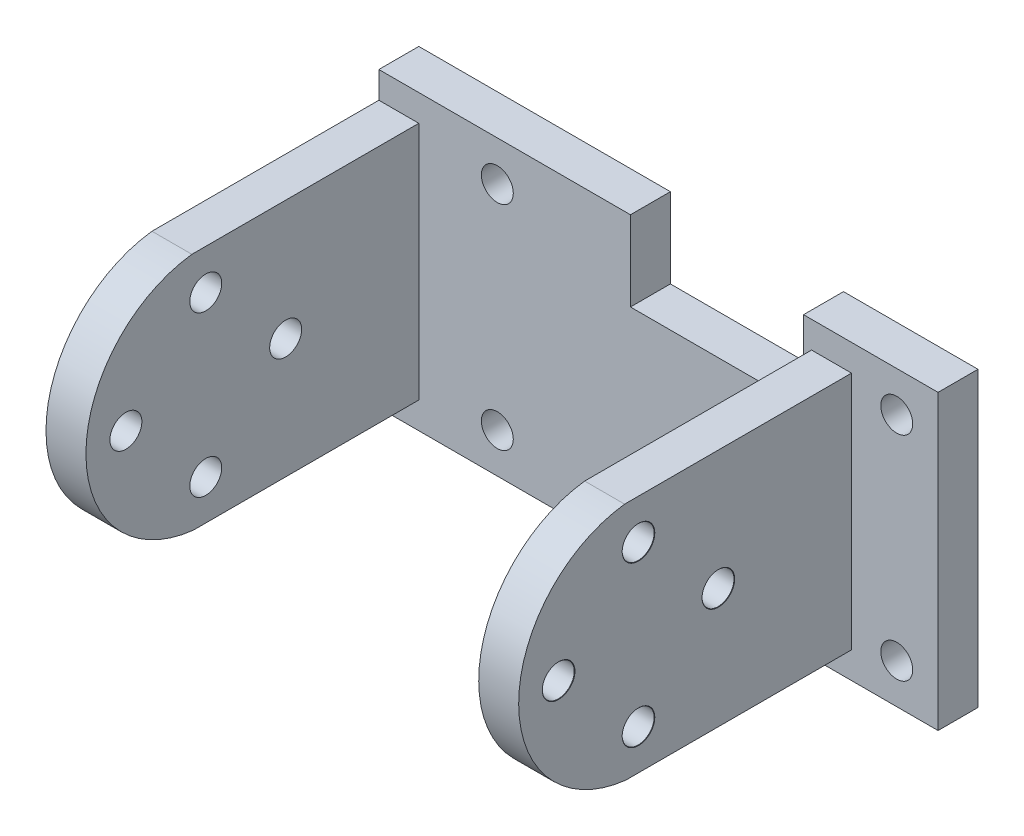
ISO-10303-21;
HEADER;
FILE_DESCRIPTION(('STEP AP214'),'2;1');
FILE_NAME('part.step','',(''),(''),'','','');
FILE_SCHEMA(('AUTOMOTIVE_DESIGN { 1 0 10303 214 1 1 1 1 }'));
ENDSEC;
DATA;
#1=APPLICATION_CONTEXT('core data for automotive mechanical design processes');
#2=APPLICATION_PROTOCOL_DEFINITION('international standard','automotive_design',2000,#1);
#3=PRODUCT_CONTEXT('',#1,'mechanical');
#4=PRODUCT('Part','Part','',(#3));
#5=PRODUCT_RELATED_PRODUCT_CATEGORY('part','',(#4));
#6=PRODUCT_DEFINITION_FORMATION('','',#4);
#7=PRODUCT_DEFINITION_CONTEXT('part definition',#1,'design');
#8=PRODUCT_DEFINITION('design','',#6,#7);
#9=PRODUCT_DEFINITION_SHAPE('','',#8);
#10=(LENGTH_UNIT() NAMED_UNIT(*) SI_UNIT(.MILLI.,.METRE.));
#11=(NAMED_UNIT(*) PLANE_ANGLE_UNIT() SI_UNIT($,.RADIAN.));
#12=(NAMED_UNIT(*) SI_UNIT($,.STERADIAN.) SOLID_ANGLE_UNIT());
#13=UNCERTAINTY_MEASURE_WITH_UNIT(LENGTH_MEASURE(1.E-05),#10,'distance_accuracy_value','');
#14=(GEOMETRIC_REPRESENTATION_CONTEXT(3) GLOBAL_UNCERTAINTY_ASSIGNED_CONTEXT((#13)) GLOBAL_UNIT_ASSIGNED_CONTEXT((#10,
#11,#12)) REPRESENTATION_CONTEXT('',''));
#15=CARTESIAN_POINT('',(0.,0.,0.));
#16=DIRECTION('',(0.,0.,1.));
#17=DIRECTION('',(1.,0.,0.));
#18=AXIS2_PLACEMENT_3D('',#15,#16,#17);
#19=CARTESIAN_POINT('',(0.,0.,163.526991532242));
#20=DIRECTION('',(0.,0.,1.));
#21=DIRECTION('',(1.,0.,0.));
#22=AXIS2_PLACEMENT_3D('',#19,#20,#21);
#23=PLANE('',#22);
#24=CARTESIAN_POINT('',(3.1033233249617,226.326974637373,163.526991532242));
#25=DIRECTION('',(0.,0.,1.));
#26=DIRECTION('',(1.,0.,0.));
#27=AXIS2_PLACEMENT_3D('',#24,#25,#26);
#28=CIRCLE('',#27,1.2);
#29=CARTESIAN_POINT('',(4.3033233249617,226.326974637373,163.526991532242));
#30=VERTEX_POINT('',#29);
#31=EDGE_CURVE('E885',#30,#30,#28,.T.);
#32=ORIENTED_EDGE('',*,*,#31,.F.);
#33=EDGE_LOOP('',(#32));
#34=FACE_BOUND('',#33,.T.);
#35=CARTESIAN_POINT('',(3.10332332496206,210.326974637373,163.526991532242));
#36=DIRECTION('',(0.,0.,1.));
#37=DIRECTION('',(1.,0.,0.));
#38=AXIS2_PLACEMENT_3D('',#35,#36,#37);
#39=CIRCLE('',#38,1.2);
#40=CARTESIAN_POINT('',(4.30332332496206,210.326974637373,163.526991532242));
#41=VERTEX_POINT('',#40);
#42=EDGE_CURVE('E887',#41,#41,#39,.T.);
#43=ORIENTED_EDGE('',*,*,#42,.F.);
#44=EDGE_LOOP('',(#43));
#45=FACE_BOUND('',#44,.T.);
#46=CARTESIAN_POINT('',(33.103323324962,210.326974637373,163.526991532242));
#47=DIRECTION('',(0.,0.,1.));
#48=DIRECTION('',(1.,0.,0.));
#49=AXIS2_PLACEMENT_3D('',#46,#47,#48);
#50=CIRCLE('',#49,1.2);
#51=CARTESIAN_POINT('',(34.303323324962,210.326974637373,163.526991532242));
#52=VERTEX_POINT('',#51);
#53=EDGE_CURVE('E895',#52,#52,#50,.T.);
#54=ORIENTED_EDGE('',*,*,#53,.F.);
#55=EDGE_LOOP('',(#54));
#56=FACE_BOUND('',#55,.T.);
#57=CARTESIAN_POINT('',(33.1033233249617,226.326974637373,163.526991532242));
#58=DIRECTION('',(0.,0.,1.));
#59=DIRECTION('',(1.,0.,0.));
#60=AXIS2_PLACEMENT_3D('',#57,#58,#59);
#61=CIRCLE('',#60,1.2);
#62=CARTESIAN_POINT('',(34.3033233249617,226.326974637373,163.526991532242));
#63=VERTEX_POINT('',#62);
#64=EDGE_CURVE('E901',#63,#63,#61,.T.);
#65=ORIENTED_EDGE('',*,*,#64,.F.);
#66=EDGE_LOOP('',(#65));
#67=FACE_BOUND('',#66,.T.);
#68=DIRECTION('',(-1.,0.,0.));
#69=VECTOR('',#68,1.);
#70=CARTESIAN_POINT('',(-2.79335335007542,227.334615140477,163.526991532241));
#71=LINE('',#70,#69);
#72=CARTESIAN_POINT('',(-2.79335335007542,227.334615140477,163.526991532241));
#73=VERTEX_POINT('',#72);
#74=CARTESIAN_POINT('',(-5.79335335007542,227.334615140477,163.526991532241));
#75=VERTEX_POINT('',#74);
#76=EDGE_CURVE('E245',#73,#75,#71,.T.);
#77=ORIENTED_EDGE('',*,*,#76,.F.);
#78=DIRECTION('',(0.,-1.,0.));
#79=VECTOR('',#78,1.);
#80=CARTESIAN_POINT('',(-2.79335335007542,227.334615140477,163.526991532241));
#81=LINE('',#80,#79);
#82=CARTESIAN_POINT('',(-2.79335335007502,209.334615140477,163.526991532241));
#83=VERTEX_POINT('',#82);
#84=EDGE_CURVE('E225',#73,#83,#81,.T.);
#85=ORIENTED_EDGE('',*,*,#84,.T.);
#86=DIRECTION('',(-1.,0.,0.));
#87=VECTOR('',#86,1.);
#88=CARTESIAN_POINT('',(-2.79335335007502,209.334615140477,163.526991532241));
#89=LINE('',#88,#87);
#90=CARTESIAN_POINT('',(-5.79335335007503,209.334615140477,163.526991532242));
#91=VERTEX_POINT('',#90);
#92=EDGE_CURVE('E242',#83,#91,#89,.T.);
#93=ORIENTED_EDGE('',*,*,#92,.T.);
#94=DIRECTION('',(0.,-1.,0.));
#95=VECTOR('',#94,1.);
#96=CARTESIAN_POINT('',(-5.79335335007547,229.334615140477,163.526991532242));
#97=LINE('',#96,#95);
#98=CARTESIAN_POINT('',(-5.79335335007498,207.334615140477,163.526991532242));
#99=VERTEX_POINT('',#98);
#100=EDGE_CURVE('E322',#91,#99,#97,.T.);
#101=ORIENTED_EDGE('',*,*,#100,.T.);
#102=DIRECTION('',(1.,0.,0.));
#103=VECTOR('',#102,1.);
#104=CARTESIAN_POINT('',(-5.79335335007498,207.334615140477,163.526991532242));
#105=LINE('',#104,#103);
#106=CARTESIAN_POINT('',(13.1033233249621,207.334615140477,163.526991532242));
#107=VERTEX_POINT('',#106);
#108=EDGE_CURVE('E304',#99,#107,#105,.T.);
#109=ORIENTED_EDGE('',*,*,#108,.T.);
#110=DIRECTION('',(0.,1.,0.));
#111=VECTOR('',#110,1.);
#112=CARTESIAN_POINT('',(13.1033233249621,207.334615140477,163.526991532242));
#113=LINE('',#112,#111);
#114=CARTESIAN_POINT('',(13.103323324962,213.334615140477,163.526991532242));
#115=VERTEX_POINT('',#114);
#116=EDGE_CURVE('E251',#107,#115,#113,.T.);
#117=ORIENTED_EDGE('',*,*,#116,.T.);
#118=DIRECTION('',(1.,0.,0.));
#119=VECTOR('',#118,1.);
#120=CARTESIAN_POINT('',(13.103323324962,213.334615140477,163.526991532242));
#121=LINE('',#120,#119);
#122=CARTESIAN_POINT('',(26.103323324962,213.334615140477,163.526991532242));
#123=VERTEX_POINT('',#122);
#124=EDGE_CURVE('E255',#115,#123,#121,.T.);
#125=ORIENTED_EDGE('',*,*,#124,.T.);
#126=DIRECTION('',(0.,-1.,0.));
#127=VECTOR('',#126,1.);
#128=CARTESIAN_POINT('',(26.103323324962,213.334615140477,163.526991532242));
#129=LINE('',#128,#127);
#130=CARTESIAN_POINT('',(26.1033233249621,207.334615140477,163.526991532242));
#131=VERTEX_POINT('',#130);
#132=EDGE_CURVE('E248',#123,#131,#129,.T.);
#133=ORIENTED_EDGE('',*,*,#132,.T.);
#134=CARTESIAN_POINT('',(36.206646649925,207.334615140478,163.526991532242));
#135=VERTEX_POINT('',#134);
#136=EDGE_CURVE('E326',#131,#135,#105,.T.);
#137=ORIENTED_EDGE('',*,*,#136,.T.);
#138=DIRECTION('',(0.,1.,0.));
#139=VECTOR('',#138,1.);
#140=CARTESIAN_POINT('',(36.206646649925,207.334615140478,163.526991532242));
#141=LINE('',#140,#139);
#142=CARTESIAN_POINT('',(36.2066466499245,229.334615140478,163.526991532242));
#143=VERTEX_POINT('',#142);
#144=EDGE_CURVE('E293',#135,#143,#141,.T.);
#145=ORIENTED_EDGE('',*,*,#144,.T.);
#146=DIRECTION('',(-1.,0.,0.));
#147=VECTOR('',#146,1.);
#148=CARTESIAN_POINT('',(36.2066466499245,229.334615140478,163.526991532242));
#149=LINE('',#148,#147);
#150=CARTESIAN_POINT('',(26.1033233249616,229.334615140477,163.526991532242));
#151=VERTEX_POINT('',#150);
#152=EDGE_CURVE('E319',#143,#151,#149,.T.);
#153=ORIENTED_EDGE('',*,*,#152,.T.);
#154=DIRECTION('',(0.,-1.,0.));
#155=VECTOR('',#154,1.);
#156=CARTESIAN_POINT('',(26.1033233249616,229.334615140477,163.526991532242));
#157=LINE('',#156,#155);
#158=CARTESIAN_POINT('',(26.1033233249618,223.334615140477,163.526991532242));
#159=VERTEX_POINT('',#158);
#160=EDGE_CURVE('E277',#151,#159,#157,.T.);
#161=ORIENTED_EDGE('',*,*,#160,.T.);
#162=DIRECTION('',(-1.,0.,0.));
#163=VECTOR('',#162,1.);
#164=CARTESIAN_POINT('',(26.1033233249618,223.334615140477,163.526991532242));
#165=LINE('',#164,#163);
#166=CARTESIAN_POINT('',(13.1033233249618,223.334615140477,163.526991532242));
#167=VERTEX_POINT('',#166);
#168=EDGE_CURVE('E281',#159,#167,#165,.T.);
#169=ORIENTED_EDGE('',*,*,#168,.T.);
#170=DIRECTION('',(0.,1.,0.));
#171=VECTOR('',#170,1.);
#172=CARTESIAN_POINT('',(13.1033233249618,223.334615140477,163.526991532242));
#173=LINE('',#172,#171);
#174=CARTESIAN_POINT('',(13.1033233249616,229.334615140477,163.526991532242));
#175=VERTEX_POINT('',#174);
#176=EDGE_CURVE('E274',#167,#175,#173,.T.);
#177=ORIENTED_EDGE('',*,*,#176,.T.);
#178=CARTESIAN_POINT('',(-5.79335335007547,229.334615140477,163.526991532242));
#179=VERTEX_POINT('',#178);
#180=EDGE_CURVE('E318',#175,#179,#149,.T.);
#181=ORIENTED_EDGE('',*,*,#180,.T.);
#182=EDGE_CURVE('E323',#179,#75,#97,.T.);
#183=ORIENTED_EDGE('',*,*,#182,.T.);
#184=EDGE_LOOP('',(#77,#85,#93,#101,#109,#117,#125,#133,#137,#145,#153,#161,#169,#177,#181,#183));
#185=FACE_BOUND('',#184,.T.);
#186=DIRECTION('',(1.,0.,0.));
#187=VECTOR('',#186,1.);
#188=CARTESIAN_POINT('',(26.7066466499292,209.334615140478,163.526991532241));
#189=LINE('',#188,#187);
#190=CARTESIAN_POINT('',(26.7066466499292,209.334615140478,163.526991532242));
#191=VERTEX_POINT('',#190);
#192=CARTESIAN_POINT('',(29.7066466499292,209.334615140478,163.526991532242));
#193=VERTEX_POINT('',#192);
#194=EDGE_CURVE('E61',#191,#193,#189,.T.);
#195=ORIENTED_EDGE('',*,*,#194,.F.);
#196=DIRECTION('',(0.,1.,0.));
#197=VECTOR('',#196,1.);
#198=CARTESIAN_POINT('',(26.7066466499292,209.334615140478,163.526991532241));
#199=LINE('',#198,#197);
#200=CARTESIAN_POINT('',(26.7066466499292,227.334615140478,163.526991532242));
#201=VERTEX_POINT('',#200);
#202=EDGE_CURVE('E56',#191,#201,#199,.T.);
#203=ORIENTED_EDGE('',*,*,#202,.T.);
#204=DIRECTION('',(1.,0.,0.));
#205=VECTOR('',#204,1.);
#206=CARTESIAN_POINT('',(26.7066466499292,227.334615140478,163.526991532241));
#207=LINE('',#206,#205);
#208=CARTESIAN_POINT('',(29.7066466499292,227.334615140478,163.526991532241));
#209=VERTEX_POINT('',#208);
#210=EDGE_CURVE('E215',#201,#209,#207,.T.);
#211=ORIENTED_EDGE('',*,*,#210,.T.);
#212=DIRECTION('',(0.,1.,0.));
#213=VECTOR('',#212,1.);
#214=CARTESIAN_POINT('',(29.7066466499292,209.334615140478,163.526991532241));
#215=LINE('',#214,#213);
#216=EDGE_CURVE('E200',#193,#209,#215,.T.);
#217=ORIENTED_EDGE('',*,*,#216,.F.);
#218=EDGE_LOOP('',(#195,#203,#211,#217));
#219=FACE_BOUND('',#218,.T.);
#220=ADVANCED_FACE('F39',(#34,#45,#56,#67,#185,#219),#23,.T.);
#221=CARTESIAN_POINT('',(-5.79335335007498,207.334615140477,160.526991532242));
#222=DIRECTION('',(0.,-1.,0.));
#223=DIRECTION('',(1.,0.,0.));
#224=AXIS2_PLACEMENT_3D('',#221,#222,#223);
#225=PLANE('',#224);
#226=DIRECTION('',(0.,0.,-1.));
#227=VECTOR('',#226,1.);
#228=CARTESIAN_POINT('',(26.1033233249621,207.334615140477,163.526991532242));
#229=LINE('',#228,#227);
#230=CARTESIAN_POINT('',(26.1033233249621,207.334615140477,160.526991532241));
#231=VERTEX_POINT('',#230);
#232=EDGE_CURVE('E258',#131,#231,#229,.T.);
#233=ORIENTED_EDGE('',*,*,#232,.T.);
#234=DIRECTION('',(1.,0.,0.));
#235=VECTOR('',#234,1.);
#236=CARTESIAN_POINT('',(-5.79335335007498,207.334615140477,160.526991532242));
#237=LINE('',#236,#235);
#238=CARTESIAN_POINT('',(36.206646649925,207.334615140478,160.526991532242));
#239=VERTEX_POINT('',#238);
#240=EDGE_CURVE('E311',#231,#239,#237,.T.);
#241=ORIENTED_EDGE('',*,*,#240,.T.);
#242=DIRECTION('',(0.,0.,1.));
#243=VECTOR('',#242,1.);
#244=CARTESIAN_POINT('',(36.206646649925,207.334615140478,160.526991532242));
#245=LINE('',#244,#243);
#246=EDGE_CURVE('E11',#239,#135,#245,.T.);
#247=ORIENTED_EDGE('',*,*,#246,.T.);
#248=ORIENTED_EDGE('',*,*,#136,.F.);
#249=EDGE_LOOP('',(#233,#241,#247,#248));
#250=FACE_BOUND('',#249,.T.);
#251=ADVANCED_FACE('F428',(#250),#225,.T.);
#252=CARTESIAN_POINT('',(36.2066466499245,229.334615140478,160.526991532242));
#253=DIRECTION('',(0.,1.,0.));
#254=DIRECTION('',(-1.,0.,0.));
#255=AXIS2_PLACEMENT_3D('',#252,#253,#254);
#256=PLANE('',#255);
#257=DIRECTION('',(0.,0.,-1.));
#258=VECTOR('',#257,1.);
#259=CARTESIAN_POINT('',(13.1033233249616,229.334615140477,163.526991532242));
#260=LINE('',#259,#258);
#261=CARTESIAN_POINT('',(13.1033233249616,229.334615140477,160.526991532241));
#262=VERTEX_POINT('',#261);
#263=EDGE_CURVE('E284',#175,#262,#260,.T.);
#264=ORIENTED_EDGE('',*,*,#263,.T.);
#265=DIRECTION('',(-1.,0.,0.));
#266=VECTOR('',#265,1.);
#267=CARTESIAN_POINT('',(36.2066466499245,229.334615140478,160.526991532242));
#268=LINE('',#267,#266);
#269=CARTESIAN_POINT('',(-5.79335335007547,229.334615140477,160.526991532242));
#270=VERTEX_POINT('',#269);
#271=EDGE_CURVE('E303',#262,#270,#268,.T.);
#272=ORIENTED_EDGE('',*,*,#271,.T.);
#273=DIRECTION('',(0.,0.,1.));
#274=VECTOR('',#273,1.);
#275=CARTESIAN_POINT('',(-5.79335335007547,229.334615140477,160.526991532242));
#276=LINE('',#275,#274);
#277=EDGE_CURVE('E331',#270,#179,#276,.T.);
#278=ORIENTED_EDGE('',*,*,#277,.T.);
#279=ORIENTED_EDGE('',*,*,#180,.F.);
#280=EDGE_LOOP('',(#264,#272,#278,#279));
#281=FACE_BOUND('',#280,.T.);
#282=ADVANCED_FACE('F454',(#281),#256,.T.);
#283=CARTESIAN_POINT('',(36.206646649925,207.334615140478,160.526991532242));
#284=DIRECTION('',(1.,0.,0.));
#285=DIRECTION('',(0.,1.,0.));
#286=AXIS2_PLACEMENT_3D('',#283,#284,#285);
#287=PLANE('',#286);
#288=ORIENTED_EDGE('',*,*,#144,.F.);
#289=ORIENTED_EDGE('',*,*,#246,.F.);
#290=DIRECTION('',(0.,1.,0.));
#291=VECTOR('',#290,1.);
#292=CARTESIAN_POINT('',(36.206646649925,207.334615140478,160.526991532242));
#293=LINE('',#292,#291);
#294=CARTESIAN_POINT('',(36.2066466499245,229.334615140478,160.526991532242));
#295=VERTEX_POINT('',#294);
#296=EDGE_CURVE('E300',#239,#295,#293,.T.);
#297=ORIENTED_EDGE('',*,*,#296,.T.);
#298=DIRECTION('',(0.,0.,1.));
#299=VECTOR('',#298,1.);
#300=CARTESIAN_POINT('',(36.2066466499245,229.334615140478,160.526991532242));
#301=LINE('',#300,#299);
#302=EDGE_CURVE('E315',#295,#143,#301,.T.);
#303=ORIENTED_EDGE('',*,*,#302,.T.);
#304=EDGE_LOOP('',(#288,#289,#297,#303));
#305=FACE_BOUND('',#304,.T.);
#306=ADVANCED_FACE('F41',(#305),#287,.T.);
#307=DIRECTION('',(0.,0.,-1.));
#308=VECTOR('',#307,1.);
#309=CARTESIAN_POINT('',(13.1033233249621,207.334615140477,163.526991532242));
#310=LINE('',#309,#308);
#311=CARTESIAN_POINT('',(13.1033233249621,207.334615140477,160.526991532241));
#312=VERTEX_POINT('',#311);
#313=EDGE_CURVE('E270',#107,#312,#310,.T.);
#314=ORIENTED_EDGE('',*,*,#313,.F.);
#315=ORIENTED_EDGE('',*,*,#108,.F.);
#316=DIRECTION('',(0.,0.,1.));
#317=VECTOR('',#316,1.);
#318=CARTESIAN_POINT('',(-5.79335335007498,207.334615140477,160.526991532242));
#319=LINE('',#318,#317);
#320=CARTESIAN_POINT('',(-5.79335335007498,207.334615140477,160.526991532242));
#321=VERTEX_POINT('',#320);
#322=EDGE_CURVE('E48',#321,#99,#319,.T.);
#323=ORIENTED_EDGE('',*,*,#322,.F.);
#324=EDGE_CURVE('E312',#321,#312,#237,.T.);
#325=ORIENTED_EDGE('',*,*,#324,.T.);
#326=EDGE_LOOP('',(#314,#315,#323,#325));
#327=FACE_BOUND('',#326,.T.);
#328=ADVANCED_FACE('F414',(#327),#225,.T.);
#329=CARTESIAN_POINT('',(-5.79335335007547,229.334615140477,160.526991532242));
#330=DIRECTION('',(-1.,0.,0.));
#331=DIRECTION('',(0.,-1.,0.));
#332=AXIS2_PLACEMENT_3D('',#329,#330,#331);
#333=PLANE('',#332);
#334=CARTESIAN_POINT('',(-5.79335335007547,224.334217217214,179.527190493873));
#335=DIRECTION('',(1.,0.,0.));
#336=DIRECTION('',(0.,0.,-1.));
#337=AXIS2_PLACEMENT_3D('',#334,#335,#336);
#338=CIRCLE('',#337,1.20000000000001);
#339=CARTESIAN_POINT('',(-5.79335335007547,224.334217217214,178.327190493873));
#340=VERTEX_POINT('',#339);
#341=EDGE_CURVE('E913',#340,#340,#338,.T.);
#342=ORIENTED_EDGE('',*,*,#341,.T.);
#343=EDGE_LOOP('',(#342));
#344=FACE_BOUND('',#343,.T.);
#345=CARTESIAN_POINT('',(-5.79335335007547,218.334416178846,185.526991532241));
#346=DIRECTION('',(1.,0.,0.));
#347=DIRECTION('',(0.,0.,-1.));
#348=AXIS2_PLACEMENT_3D('',#345,#346,#347);
#349=CIRCLE('',#348,1.20000000000001);
#350=CARTESIAN_POINT('',(-5.79335335007547,218.334416178846,184.326991532241));
#351=VERTEX_POINT('',#350);
#352=EDGE_CURVE('E346',#351,#351,#349,.T.);
#353=ORIENTED_EDGE('',*,*,#352,.T.);
#354=EDGE_LOOP('',(#353));
#355=FACE_BOUND('',#354,.T.);
#356=CARTESIAN_POINT('',(-5.79335335007547,212.334615140478,179.527190493873));
#357=DIRECTION('',(1.,0.,0.));
#358=DIRECTION('',(0.,0.,-1.));
#359=AXIS2_PLACEMENT_3D('',#356,#357,#358);
#360=CIRCLE('',#359,1.20000000000001);
#361=CARTESIAN_POINT('',(-5.79335335007547,212.334615140478,178.327190493873));
#362=VERTEX_POINT('',#361);
#363=EDGE_CURVE('E342',#362,#362,#360,.T.);
#364=ORIENTED_EDGE('',*,*,#363,.T.);
#365=EDGE_LOOP('',(#364));
#366=FACE_BOUND('',#365,.T.);
#367=CARTESIAN_POINT('',(-5.79335335007547,218.334416178846,173.527389455505));
#368=DIRECTION('',(1.,0.,0.));
#369=DIRECTION('',(0.,0.,-1.));
#370=AXIS2_PLACEMENT_3D('',#367,#368,#369);
#371=CIRCLE('',#370,1.20000000000001);
#372=CARTESIAN_POINT('',(-5.79335335007547,218.334416178846,172.327389455505));
#373=VERTEX_POINT('',#372);
#374=EDGE_CURVE('E338',#373,#373,#371,.T.);
#375=ORIENTED_EDGE('',*,*,#374,.T.);
#376=EDGE_LOOP('',(#375));
#377=FACE_BOUND('',#376,.T.);
#378=ORIENTED_EDGE('',*,*,#182,.F.);
#379=ORIENTED_EDGE('',*,*,#277,.F.);
#380=DIRECTION('',(0.,-1.,0.));
#381=VECTOR('',#380,1.);
#382=CARTESIAN_POINT('',(-5.79335335007547,229.334615140477,160.526991532242));
#383=LINE('',#382,#381);
#384=EDGE_CURVE('E308',#270,#321,#383,.T.);
#385=ORIENTED_EDGE('',*,*,#384,.T.);
#386=ORIENTED_EDGE('',*,*,#322,.T.);
#387=ORIENTED_EDGE('',*,*,#100,.F.);
#388=DIRECTION('',(0.,0.,1.));
#389=VECTOR('',#388,1.);
#390=CARTESIAN_POINT('',(-5.79335335007503,209.334615140477,163.526991532241));
#391=LINE('',#390,#389);
#392=CARTESIAN_POINT('',(-5.79335335007503,209.334615140477,180.473917610371));
#393=VERTEX_POINT('',#392);
#394=EDGE_CURVE('E222',#91,#393,#391,.T.);
#395=ORIENTED_EDGE('',*,*,#394,.T.);
#396=CARTESIAN_POINT('',(-5.79335335007522,218.340265597928,179.465004194161));
#397=DIRECTION('',(-1.,0.,0.));
#398=DIRECTION('',(0.,-1.,0.));
#399=AXIS2_PLACEMENT_3D('',#396,#397,#398);
#400=CIRCLE('',#399,9.06198909970576);
#401=CARTESIAN_POINT('',(-5.79335335007542,227.334615140477,180.570138914287));
#402=VERTEX_POINT('',#401);
#403=EDGE_CURVE('E214',#393,#402,#400,.T.);
#404=ORIENTED_EDGE('',*,*,#403,.T.);
#405=DIRECTION('',(0.,0.,-1.));
#406=VECTOR('',#405,1.);
#407=CARTESIAN_POINT('',(-5.79335335007542,227.334615140477,180.570138914287));
#408=LINE('',#407,#406);
#409=EDGE_CURVE('E234',#402,#75,#408,.T.);
#410=ORIENTED_EDGE('',*,*,#409,.T.);
#411=EDGE_LOOP('',(#378,#379,#385,#386,#387,#395,#404,#410));
#412=FACE_BOUND('',#411,.T.);
#413=ADVANCED_FACE('F379',(#344,#355,#366,#377,#412),#333,.T.);
#414=DIRECTION('',(0.,0.,-1.));
#415=VECTOR('',#414,1.);
#416=CARTESIAN_POINT('',(26.1033233249616,229.334615140477,163.526991532242));
#417=LINE('',#416,#415);
#418=CARTESIAN_POINT('',(26.1033233249616,229.334615140477,160.526991532241));
#419=VERTEX_POINT('',#418);
#420=EDGE_CURVE('E296',#151,#419,#417,.T.);
#421=ORIENTED_EDGE('',*,*,#420,.F.);
#422=ORIENTED_EDGE('',*,*,#152,.F.);
#423=ORIENTED_EDGE('',*,*,#302,.F.);
#424=EDGE_CURVE('E305',#295,#419,#268,.T.);
#425=ORIENTED_EDGE('',*,*,#424,.T.);
#426=EDGE_LOOP('',(#421,#422,#423,#425));
#427=FACE_BOUND('',#426,.T.);
#428=ADVANCED_FACE('F437',(#427),#256,.T.);
#429=CARTESIAN_POINT('',(0.,0.,160.526991532242));
#430=DIRECTION('',(0.,0.,1.));
#431=DIRECTION('',(1.,0.,0.));
#432=AXIS2_PLACEMENT_3D('',#429,#430,#431);
#433=PLANE('',#432);
#434=CARTESIAN_POINT('',(3.1033233249617,226.326974637373,160.526991532241));
#435=DIRECTION('',(0.,0.,1.));
#436=DIRECTION('',(1.,0.,0.));
#437=AXIS2_PLACEMENT_3D('',#434,#435,#436);
#438=CIRCLE('',#437,1.2);
#439=CARTESIAN_POINT('',(4.3033233249617,226.326974637373,160.526991532241));
#440=VERTEX_POINT('',#439);
#441=EDGE_CURVE('E883',#440,#440,#438,.T.);
#442=ORIENTED_EDGE('',*,*,#441,.T.);
#443=EDGE_LOOP('',(#442));
#444=FACE_BOUND('',#443,.T.);
#445=CARTESIAN_POINT('',(3.10332332496206,210.326974637373,160.526991532241));
#446=DIRECTION('',(0.,0.,1.));
#447=DIRECTION('',(1.,0.,0.));
#448=AXIS2_PLACEMENT_3D('',#445,#446,#447);
#449=CIRCLE('',#448,1.2);
#450=CARTESIAN_POINT('',(4.30332332496206,210.326974637373,160.526991532241));
#451=VERTEX_POINT('',#450);
#452=EDGE_CURVE('E892',#451,#451,#449,.T.);
#453=ORIENTED_EDGE('',*,*,#452,.T.);
#454=EDGE_LOOP('',(#453));
#455=FACE_BOUND('',#454,.T.);
#456=CARTESIAN_POINT('',(33.103323324962,210.326974637373,160.526991532241));
#457=DIRECTION('',(0.,0.,1.));
#458=DIRECTION('',(1.,0.,0.));
#459=AXIS2_PLACEMENT_3D('',#456,#457,#458);
#460=CIRCLE('',#459,1.2);
#461=CARTESIAN_POINT('',(34.303323324962,210.326974637373,160.526991532241));
#462=VERTEX_POINT('',#461);
#463=EDGE_CURVE('E898',#462,#462,#460,.T.);
#464=ORIENTED_EDGE('',*,*,#463,.T.);
#465=EDGE_LOOP('',(#464));
#466=FACE_BOUND('',#465,.T.);
#467=CARTESIAN_POINT('',(33.1033233249617,226.326974637373,160.526991532241));
#468=DIRECTION('',(0.,0.,1.));
#469=DIRECTION('',(1.,0.,0.));
#470=AXIS2_PLACEMENT_3D('',#467,#468,#469);
#471=CIRCLE('',#470,1.2);
#472=CARTESIAN_POINT('',(34.3033233249617,226.326974637373,160.526991532241));
#473=VERTEX_POINT('',#472);
#474=EDGE_CURVE('E904',#473,#473,#471,.T.);
#475=ORIENTED_EDGE('',*,*,#474,.T.);
#476=EDGE_LOOP('',(#475));
#477=FACE_BOUND('',#476,.T.);
#478=ORIENTED_EDGE('',*,*,#240,.F.);
#479=DIRECTION('',(0.,-1.,0.));
#480=VECTOR('',#479,1.);
#481=CARTESIAN_POINT('',(26.103323324962,213.334615140477,160.526991532241));
#482=LINE('',#481,#480);
#483=CARTESIAN_POINT('',(26.103323324962,213.334615140477,160.526991532241));
#484=VERTEX_POINT('',#483);
#485=EDGE_CURVE('E241',#484,#231,#482,.T.);
#486=ORIENTED_EDGE('',*,*,#485,.F.);
#487=DIRECTION('',(1.,0.,0.));
#488=VECTOR('',#487,1.);
#489=CARTESIAN_POINT('',(13.103323324962,213.334615140477,160.526991532241));
#490=LINE('',#489,#488);
#491=CARTESIAN_POINT('',(13.103323324962,213.334615140477,160.526991532241));
#492=VERTEX_POINT('',#491);
#493=EDGE_CURVE('E252',#492,#484,#490,.T.);
#494=ORIENTED_EDGE('',*,*,#493,.F.);
#495=DIRECTION('',(0.,1.,0.));
#496=VECTOR('',#495,1.);
#497=CARTESIAN_POINT('',(13.1033233249621,207.334615140477,160.526991532241));
#498=LINE('',#497,#496);
#499=EDGE_CURVE('E260',#312,#492,#498,.T.);
#500=ORIENTED_EDGE('',*,*,#499,.F.);
#501=ORIENTED_EDGE('',*,*,#324,.F.);
#502=ORIENTED_EDGE('',*,*,#384,.F.);
#503=ORIENTED_EDGE('',*,*,#271,.F.);
#504=DIRECTION('',(0.,1.,0.));
#505=VECTOR('',#504,1.);
#506=CARTESIAN_POINT('',(13.1033233249618,223.334615140477,160.526991532241));
#507=LINE('',#506,#505);
#508=CARTESIAN_POINT('',(13.1033233249618,223.334615140477,160.526991532241));
#509=VERTEX_POINT('',#508);
#510=EDGE_CURVE('E267',#509,#262,#507,.T.);
#511=ORIENTED_EDGE('',*,*,#510,.F.);
#512=DIRECTION('',(-1.,0.,0.));
#513=VECTOR('',#512,1.);
#514=CARTESIAN_POINT('',(26.1033233249618,223.334615140477,160.526991532241));
#515=LINE('',#514,#513);
#516=CARTESIAN_POINT('',(26.1033233249618,223.334615140477,160.526991532241));
#517=VERTEX_POINT('',#516);
#518=EDGE_CURVE('E278',#517,#509,#515,.T.);
#519=ORIENTED_EDGE('',*,*,#518,.F.);
#520=DIRECTION('',(0.,-1.,0.));
#521=VECTOR('',#520,1.);
#522=CARTESIAN_POINT('',(26.1033233249616,229.334615140477,160.526991532241));
#523=LINE('',#522,#521);
#524=EDGE_CURVE('E286',#419,#517,#523,.T.);
#525=ORIENTED_EDGE('',*,*,#524,.F.);
#526=ORIENTED_EDGE('',*,*,#424,.F.);
#527=ORIENTED_EDGE('',*,*,#296,.F.);
#528=EDGE_LOOP('',(#478,#486,#494,#500,#501,#502,#503,#511,#519,#525,#526,#527));
#529=FACE_BOUND('',#528,.T.);
#530=ADVANCED_FACE('F445',(#444,#455,#466,#477,#529),#433,.F.);
#531=CARTESIAN_POINT('',(13.1033233249618,223.334615140477,163.526991532242));
#532=DIRECTION('',(-1.,0.,0.));
#533=DIRECTION('',(0.,-1.,0.));
#534=AXIS2_PLACEMENT_3D('',#531,#532,#533);
#535=PLANE('',#534);
#536=ORIENTED_EDGE('',*,*,#510,.T.);
#537=ORIENTED_EDGE('',*,*,#263,.F.);
#538=ORIENTED_EDGE('',*,*,#176,.F.);
#539=DIRECTION('',(0.,0.,-1.));
#540=VECTOR('',#539,1.);
#541=CARTESIAN_POINT('',(13.1033233249618,223.334615140477,163.526991532242));
#542=LINE('',#541,#540);
#543=EDGE_CURVE('E291',#167,#509,#542,.T.);
#544=ORIENTED_EDGE('',*,*,#543,.T.);
#545=EDGE_LOOP('',(#536,#537,#538,#544));
#546=FACE_BOUND('',#545,.T.);
#547=ADVANCED_FACE('F487',(#546),#535,.F.);
#548=CARTESIAN_POINT('',(26.1033233249618,223.334615140477,163.526991532242));
#549=DIRECTION('',(0.,-1.,0.));
#550=DIRECTION('',(1.,0.,0.));
#551=AXIS2_PLACEMENT_3D('',#548,#549,#550);
#552=PLANE('',#551);
#553=ORIENTED_EDGE('',*,*,#518,.T.);
#554=ORIENTED_EDGE('',*,*,#543,.F.);
#555=ORIENTED_EDGE('',*,*,#168,.F.);
#556=DIRECTION('',(0.,0.,-1.));
#557=VECTOR('',#556,1.);
#558=CARTESIAN_POINT('',(26.1033233249618,223.334615140477,163.526991532242));
#559=LINE('',#558,#557);
#560=EDGE_CURVE('E294',#159,#517,#559,.T.);
#561=ORIENTED_EDGE('',*,*,#560,.T.);
#562=EDGE_LOOP('',(#553,#554,#555,#561));
#563=FACE_BOUND('',#562,.T.);
#564=ADVANCED_FACE('F449',(#563),#552,.F.);
#565=CARTESIAN_POINT('',(26.1033233249616,229.334615140477,163.526991532242));
#566=DIRECTION('',(1.,0.,0.));
#567=DIRECTION('',(0.,1.,0.));
#568=AXIS2_PLACEMENT_3D('',#565,#566,#567);
#569=PLANE('',#568);
#570=ORIENTED_EDGE('',*,*,#524,.T.);
#571=ORIENTED_EDGE('',*,*,#560,.F.);
#572=ORIENTED_EDGE('',*,*,#160,.F.);
#573=ORIENTED_EDGE('',*,*,#420,.T.);
#574=EDGE_LOOP('',(#570,#571,#572,#573));
#575=FACE_BOUND('',#574,.T.);
#576=ADVANCED_FACE('F441',(#575),#569,.F.);
#577=CARTESIAN_POINT('',(26.103323324962,213.334615140477,163.526991532242));
#578=DIRECTION('',(1.,0.,0.));
#579=DIRECTION('',(0.,1.,0.));
#580=AXIS2_PLACEMENT_3D('',#577,#578,#579);
#581=PLANE('',#580);
#582=ORIENTED_EDGE('',*,*,#485,.T.);
#583=ORIENTED_EDGE('',*,*,#232,.F.);
#584=ORIENTED_EDGE('',*,*,#132,.F.);
#585=DIRECTION('',(0.,0.,-1.));
#586=VECTOR('',#585,1.);
#587=CARTESIAN_POINT('',(26.103323324962,213.334615140477,163.526991532242));
#588=LINE('',#587,#586);
#589=EDGE_CURVE('E265',#123,#484,#588,.T.);
#590=ORIENTED_EDGE('',*,*,#589,.T.);
#591=EDGE_LOOP('',(#582,#583,#584,#590));
#592=FACE_BOUND('',#591,.T.);
#593=ADVANCED_FACE('F425',(#592),#581,.F.);
#594=CARTESIAN_POINT('',(13.103323324962,213.334615140477,163.526991532242));
#595=DIRECTION('',(0.,1.,0.));
#596=DIRECTION('',(-1.,0.,0.));
#597=AXIS2_PLACEMENT_3D('',#594,#595,#596);
#598=PLANE('',#597);
#599=ORIENTED_EDGE('',*,*,#493,.T.);
#600=ORIENTED_EDGE('',*,*,#589,.F.);
#601=ORIENTED_EDGE('',*,*,#124,.F.);
#602=DIRECTION('',(0.,0.,-1.));
#603=VECTOR('',#602,1.);
#604=CARTESIAN_POINT('',(13.103323324962,213.334615140477,163.526991532242));
#605=LINE('',#604,#603);
#606=EDGE_CURVE('E268',#115,#492,#605,.T.);
#607=ORIENTED_EDGE('',*,*,#606,.T.);
#608=EDGE_LOOP('',(#599,#600,#601,#607));
#609=FACE_BOUND('',#608,.T.);
#610=ADVANCED_FACE('F421',(#609),#598,.F.);
#611=CARTESIAN_POINT('',(13.1033233249621,207.334615140477,163.526991532242));
#612=DIRECTION('',(-1.,0.,0.));
#613=DIRECTION('',(0.,-1.,0.));
#614=AXIS2_PLACEMENT_3D('',#611,#612,#613);
#615=PLANE('',#614);
#616=ORIENTED_EDGE('',*,*,#499,.T.);
#617=ORIENTED_EDGE('',*,*,#606,.F.);
#618=ORIENTED_EDGE('',*,*,#116,.F.);
#619=ORIENTED_EDGE('',*,*,#313,.T.);
#620=EDGE_LOOP('',(#616,#617,#618,#619));
#621=FACE_BOUND('',#620,.T.);
#622=ADVANCED_FACE('F417',(#621),#615,.F.);
#623=CARTESIAN_POINT('',(-2.79335335007522,218.340265597928,179.465004194161));
#624=DIRECTION('',(-1.,0.,0.));
#625=DIRECTION('',(0.,-1.,0.));
#626=AXIS2_PLACEMENT_3D('',#623,#624,#625);
#627=CYLINDRICAL_SURFACE('',#626,9.06198909970576);
#628=ORIENTED_EDGE('',*,*,#403,.F.);
#629=DIRECTION('',(-1.,0.,0.));
#630=VECTOR('',#629,1.);
#631=CARTESIAN_POINT('',(-2.79335335007502,209.334615140477,180.473917610371));
#632=LINE('',#631,#630);
#633=CARTESIAN_POINT('',(-2.79335335007502,209.334615140477,180.473917610371));
#634=VERTEX_POINT('',#633);
#635=EDGE_CURVE('E239',#634,#393,#632,.T.);
#636=ORIENTED_EDGE('',*,*,#635,.F.);
#637=CARTESIAN_POINT('',(-2.79335335007522,218.340265597928,179.465004194161));
#638=DIRECTION('',(-1.,0.,0.));
#639=DIRECTION('',(0.,-1.,0.));
#640=AXIS2_PLACEMENT_3D('',#637,#638,#639);
#641=CIRCLE('',#640,9.06198909970576);
#642=CARTESIAN_POINT('',(-2.79335335007542,227.334615140477,180.570138914287));
#643=VERTEX_POINT('',#642);
#644=EDGE_CURVE('E218',#634,#643,#641,.T.);
#645=ORIENTED_EDGE('',*,*,#644,.T.);
#646=DIRECTION('',(-1.,0.,0.));
#647=VECTOR('',#646,1.);
#648=CARTESIAN_POINT('',(-2.79335335007542,227.334615140477,180.570138914287));
#649=LINE('',#648,#647);
#650=EDGE_CURVE('E231',#643,#402,#649,.T.);
#651=ORIENTED_EDGE('',*,*,#650,.T.);
#652=EDGE_LOOP('',(#628,#636,#645,#651));
#653=FACE_BOUND('',#652,.T.);
#654=ADVANCED_FACE('F457',(#653),#627,.T.);
#655=CARTESIAN_POINT('',(-2.79335335007502,209.334615140477,163.526991532241));
#656=DIRECTION('',(0.,-1.,0.));
#657=DIRECTION('',(1.,0.,0.));
#658=AXIS2_PLACEMENT_3D('',#655,#656,#657);
#659=PLANE('',#658);
#660=ORIENTED_EDGE('',*,*,#394,.F.);
#661=ORIENTED_EDGE('',*,*,#92,.F.);
#662=DIRECTION('',(0.,0.,1.));
#663=VECTOR('',#662,1.);
#664=CARTESIAN_POINT('',(-2.79335335007502,209.334615140477,163.526991532241));
#665=LINE('',#664,#663);
#666=EDGE_CURVE('E228',#83,#634,#665,.T.);
#667=ORIENTED_EDGE('',*,*,#666,.T.);
#668=ORIENTED_EDGE('',*,*,#635,.T.);
#669=EDGE_LOOP('',(#660,#661,#667,#668));
#670=FACE_BOUND('',#669,.T.);
#671=ADVANCED_FACE('F402',(#670),#659,.T.);
#672=CARTESIAN_POINT('',(-2.79335335007542,227.334615140477,180.570138914287));
#673=DIRECTION('',(0.,1.,0.));
#674=DIRECTION('',(-1.,0.,0.));
#675=AXIS2_PLACEMENT_3D('',#672,#673,#674);
#676=PLANE('',#675);
#677=ORIENTED_EDGE('',*,*,#409,.F.);
#678=ORIENTED_EDGE('',*,*,#650,.F.);
#679=DIRECTION('',(0.,0.,-1.));
#680=VECTOR('',#679,1.);
#681=CARTESIAN_POINT('',(-2.79335335007542,227.334615140477,180.570138914287));
#682=LINE('',#681,#680);
#683=EDGE_CURVE('E221',#643,#73,#682,.T.);
#684=ORIENTED_EDGE('',*,*,#683,.T.);
#685=ORIENTED_EDGE('',*,*,#76,.T.);
#686=EDGE_LOOP('',(#677,#678,#684,#685));
#687=FACE_BOUND('',#686,.T.);
#688=ADVANCED_FACE('F394',(#687),#676,.T.);
#689=CARTESIAN_POINT('',(-2.79335335007522,218.340265597928,179.465004194161));
#690=DIRECTION('',(-1.,0.,0.));
#691=DIRECTION('',(0.,-1.,0.));
#692=AXIS2_PLACEMENT_3D('',#689,#690,#691);
#693=PLANE('',#692);
#694=CARTESIAN_POINT('',(-2.79335335007536,224.334217217214,179.527190493873));
#695=DIRECTION('',(-1.,0.,0.));
#696=DIRECTION('',(0.,-1.,0.));
#697=AXIS2_PLACEMENT_3D('',#694,#695,#696);
#698=CIRCLE('',#697,1.20000000000001);
#699=CARTESIAN_POINT('',(-2.79335335007533,223.134217217214,179.527190493873));
#700=VERTEX_POINT('',#699);
#701=EDGE_CURVE('E916',#700,#700,#698,.T.);
#702=ORIENTED_EDGE('',*,*,#701,.T.);
#703=EDGE_LOOP('',(#702));
#704=FACE_BOUND('',#703,.T.);
#705=CARTESIAN_POINT('',(-2.79335335007522,218.334416178846,185.526991532241));
#706=DIRECTION('',(-1.,0.,0.));
#707=DIRECTION('',(0.,-1.,0.));
#708=AXIS2_PLACEMENT_3D('',#705,#706,#707);
#709=CIRCLE('',#708,1.20000000000001);
#710=CARTESIAN_POINT('',(-2.7933533500752,217.134416178846,185.526991532241));
#711=VERTEX_POINT('',#710);
#712=EDGE_CURVE('E345',#711,#711,#709,.T.);
#713=ORIENTED_EDGE('',*,*,#712,.T.);
#714=EDGE_LOOP('',(#713));
#715=FACE_BOUND('',#714,.T.);
#716=CARTESIAN_POINT('',(-2.79335335007509,212.334615140478,179.527190493873));
#717=DIRECTION('',(-1.,0.,0.));
#718=DIRECTION('',(0.,-1.,0.));
#719=AXIS2_PLACEMENT_3D('',#716,#717,#718);
#720=CIRCLE('',#719,1.20000000000001);
#721=CARTESIAN_POINT('',(-2.79335335007507,211.134615140478,179.527190493873));
#722=VERTEX_POINT('',#721);
#723=EDGE_CURVE('E341',#722,#722,#720,.T.);
#724=ORIENTED_EDGE('',*,*,#723,.T.);
#725=EDGE_LOOP('',(#724));
#726=FACE_BOUND('',#725,.T.);
#727=CARTESIAN_POINT('',(-2.79335335007522,218.334416178846,173.527389455505));
#728=DIRECTION('',(-1.,0.,0.));
#729=DIRECTION('',(0.,-1.,0.));
#730=AXIS2_PLACEMENT_3D('',#727,#728,#729);
#731=CIRCLE('',#730,1.20000000000001);
#732=CARTESIAN_POINT('',(-2.7933533500752,217.134416178846,173.527389455505));
#733=VERTEX_POINT('',#732);
#734=EDGE_CURVE('E203',#733,#733,#731,.T.);
#735=ORIENTED_EDGE('',*,*,#734,.T.);
#736=EDGE_LOOP('',(#735));
#737=FACE_BOUND('',#736,.T.);
#738=ORIENTED_EDGE('',*,*,#644,.F.);
#739=ORIENTED_EDGE('',*,*,#666,.F.);
#740=ORIENTED_EDGE('',*,*,#84,.F.);
#741=ORIENTED_EDGE('',*,*,#683,.F.);
#742=EDGE_LOOP('',(#738,#739,#740,#741));
#743=FACE_BOUND('',#742,.T.);
#744=ADVANCED_FACE('F391',(#704,#715,#726,#737,#743),#693,.F.);
#745=CARTESIAN_POINT('',(26.7066466499292,218.340265597929,179.465004194161));
#746=DIRECTION('',(1.,0.,0.));
#747=DIRECTION('',(0.,0.,-1.));
#748=AXIS2_PLACEMENT_3D('',#745,#746,#747);
#749=CYLINDRICAL_SURFACE('',#748,9.06198909970577);
#750=CARTESIAN_POINT('',(29.7066466499292,218.340265597929,179.465004194161));
#751=DIRECTION('',(1.,0.,0.));
#752=DIRECTION('',(0.,0.,-1.));
#753=AXIS2_PLACEMENT_3D('',#750,#751,#752);
#754=CIRCLE('',#753,9.06198909970577);
#755=CARTESIAN_POINT('',(29.7066466499292,227.334615140478,180.570138914287));
#756=VERTEX_POINT('',#755);
#757=CARTESIAN_POINT('',(29.7066466499292,209.334615140478,180.473917610371));
#758=VERTEX_POINT('',#757);
#759=EDGE_CURVE('E208',#756,#758,#754,.T.);
#760=ORIENTED_EDGE('',*,*,#759,.F.);
#761=DIRECTION('',(1.,0.,0.));
#762=VECTOR('',#761,1.);
#763=CARTESIAN_POINT('',(26.7066466499292,227.334615140478,180.570138914287));
#764=LINE('',#763,#762);
#765=CARTESIAN_POINT('',(26.7066466499292,227.334615140478,180.570138914287));
#766=VERTEX_POINT('',#765);
#767=EDGE_CURVE('E196',#766,#756,#764,.T.);
#768=ORIENTED_EDGE('',*,*,#767,.F.);
#769=CARTESIAN_POINT('',(26.7066466499292,218.340265597929,179.465004194161));
#770=DIRECTION('',(1.,0.,0.));
#771=DIRECTION('',(0.,0.,-1.));
#772=AXIS2_PLACEMENT_3D('',#769,#770,#771);
#773=CIRCLE('',#772,9.06198909970577);
#774=CARTESIAN_POINT('',(26.7066466499292,209.334615140478,180.473917610371));
#775=VERTEX_POINT('',#774);
#776=EDGE_CURVE('E192',#766,#775,#773,.T.);
#777=ORIENTED_EDGE('',*,*,#776,.T.);
#778=DIRECTION('',(1.,0.,0.));
#779=VECTOR('',#778,1.);
#780=CARTESIAN_POINT('',(26.7066466499292,209.334615140478,180.473917610371));
#781=LINE('',#780,#779);
#782=EDGE_CURVE('E176',#775,#758,#781,.T.);
#783=ORIENTED_EDGE('',*,*,#782,.T.);
#784=EDGE_LOOP('',(#760,#768,#777,#783));
#785=FACE_BOUND('',#784,.T.);
#786=ADVANCED_FACE('F195',(#785),#749,.T.);
#787=CARTESIAN_POINT('',(26.7066466499292,227.334615140478,163.526991532241));
#788=DIRECTION('',(0.,1.,0.));
#789=DIRECTION('',(0.,0.,1.));
#790=AXIS2_PLACEMENT_3D('',#787,#788,#789);
#791=PLANE('',#790);
#792=DIRECTION('',(0.,0.,1.));
#793=VECTOR('',#792,1.);
#794=CARTESIAN_POINT('',(29.7066466499292,227.334615140478,163.526991532241));
#795=LINE('',#794,#793);
#796=EDGE_CURVE('E197',#209,#756,#795,.T.);
#797=ORIENTED_EDGE('',*,*,#796,.F.);
#798=ORIENTED_EDGE('',*,*,#210,.F.);
#799=DIRECTION('',(0.,0.,1.));
#800=VECTOR('',#799,1.);
#801=CARTESIAN_POINT('',(26.7066466499292,227.334615140478,163.526991532241));
#802=LINE('',#801,#800);
#803=EDGE_CURVE('E186',#201,#766,#802,.T.);
#804=ORIENTED_EDGE('',*,*,#803,.T.);
#805=ORIENTED_EDGE('',*,*,#767,.T.);
#806=EDGE_LOOP('',(#797,#798,#804,#805));
#807=FACE_BOUND('',#806,.T.);
#808=ADVANCED_FACE('F750',(#807),#791,.T.);
#809=CARTESIAN_POINT('',(26.7066466499292,209.334615140478,180.473917610371));
#810=DIRECTION('',(0.,-1.,0.));
#811=DIRECTION('',(0.,0.,-1.));
#812=AXIS2_PLACEMENT_3D('',#809,#810,#811);
#813=PLANE('',#812);
#814=DIRECTION('',(0.,0.,-1.));
#815=VECTOR('',#814,1.);
#816=CARTESIAN_POINT('',(29.7066466499292,209.334615140478,180.473917610371));
#817=LINE('',#816,#815);
#818=EDGE_CURVE('E181',#758,#193,#817,.T.);
#819=ORIENTED_EDGE('',*,*,#818,.F.);
#820=ORIENTED_EDGE('',*,*,#782,.F.);
#821=DIRECTION('',(0.,0.,-1.));
#822=VECTOR('',#821,1.);
#823=CARTESIAN_POINT('',(26.7066466499292,209.334615140478,180.473917610371));
#824=LINE('',#823,#822);
#825=EDGE_CURVE('E179',#775,#191,#824,.T.);
#826=ORIENTED_EDGE('',*,*,#825,.T.);
#827=ORIENTED_EDGE('',*,*,#194,.T.);
#828=EDGE_LOOP('',(#819,#820,#826,#827));
#829=FACE_BOUND('',#828,.T.);
#830=ADVANCED_FACE('F178',(#829),#813,.T.);
#831=CARTESIAN_POINT('',(26.7066466499292,218.340265597929,179.465004194161));
#832=DIRECTION('',(1.,0.,0.));
#833=DIRECTION('',(0.,0.,-1.));
#834=AXIS2_PLACEMENT_3D('',#831,#832,#833);
#835=PLANE('',#834);
#836=CARTESIAN_POINT('',(26.7066466499292,224.334217217214,179.527190493873));
#837=DIRECTION('',(1.,0.,0.));
#838=DIRECTION('',(0.,0.,-1.));
#839=AXIS2_PLACEMENT_3D('',#836,#837,#838);
#840=CIRCLE('',#839,1.20000000000001);
#841=CARTESIAN_POINT('',(26.7066466499292,224.334217217214,178.327190493873));
#842=VERTEX_POINT('',#841);
#843=EDGE_CURVE('E43',#842,#842,#840,.T.);
#844=ORIENTED_EDGE('',*,*,#843,.T.);
#845=EDGE_LOOP('',(#844));
#846=FACE_BOUND('',#845,.T.);
#847=CARTESIAN_POINT('',(26.7066466499292,218.334416178846,185.526991532241));
#848=DIRECTION('',(1.,0.,0.));
#849=DIRECTION('',(0.,0.,-1.));
#850=AXIS2_PLACEMENT_3D('',#847,#848,#849);
#851=CIRCLE('',#850,1.20000000000001);
#852=CARTESIAN_POINT('',(26.7066466499292,218.334416178846,184.326991532241));
#853=VERTEX_POINT('',#852);
#854=EDGE_CURVE('E343',#853,#853,#851,.T.);
#855=ORIENTED_EDGE('',*,*,#854,.T.);
#856=EDGE_LOOP('',(#855));
#857=FACE_BOUND('',#856,.T.);
#858=CARTESIAN_POINT('',(26.7066466499292,212.334615140478,179.527190493873));
#859=DIRECTION('',(1.,0.,0.));
#860=DIRECTION('',(0.,0.,-1.));
#861=AXIS2_PLACEMENT_3D('',#858,#859,#860);
#862=CIRCLE('',#861,1.20000000000001);
#863=CARTESIAN_POINT('',(26.7066466499292,212.334615140478,178.327190493873));
#864=VERTEX_POINT('',#863);
#865=EDGE_CURVE('E339',#864,#864,#862,.T.);
#866=ORIENTED_EDGE('',*,*,#865,.T.);
#867=EDGE_LOOP('',(#866));
#868=FACE_BOUND('',#867,.T.);
#869=CARTESIAN_POINT('',(26.7066466499292,218.334416178846,173.527389455505));
#870=DIRECTION('',(1.,0.,0.));
#871=DIRECTION('',(0.,0.,-1.));
#872=AXIS2_PLACEMENT_3D('',#869,#870,#871);
#873=CIRCLE('',#872,1.20000000000001);
#874=CARTESIAN_POINT('',(26.7066466499292,218.334416178846,172.327389455505));
#875=VERTEX_POINT('',#874);
#876=EDGE_CURVE('E335',#875,#875,#873,.T.);
#877=ORIENTED_EDGE('',*,*,#876,.T.);
#878=EDGE_LOOP('',(#877));
#879=FACE_BOUND('',#878,.T.);
#880=ORIENTED_EDGE('',*,*,#776,.F.);
#881=ORIENTED_EDGE('',*,*,#803,.F.);
#882=ORIENTED_EDGE('',*,*,#202,.F.);
#883=ORIENTED_EDGE('',*,*,#825,.F.);
#884=EDGE_LOOP('',(#880,#881,#882,#883));
#885=FACE_BOUND('',#884,.T.);
#886=ADVANCED_FACE('F190',(#846,#857,#868,#879,#885),#835,.F.);
#887=CARTESIAN_POINT('',(29.7066466499292,218.340265597929,179.465004194161));
#888=DIRECTION('',(1.,0.,0.));
#889=DIRECTION('',(0.,0.,-1.));
#890=AXIS2_PLACEMENT_3D('',#887,#888,#889);
#891=PLANE('',#890);
#892=CARTESIAN_POINT('',(29.7066466499292,224.334217217214,179.527190493873));
#893=DIRECTION('',(1.,0.,0.));
#894=DIRECTION('',(0.,0.,-1.));
#895=AXIS2_PLACEMENT_3D('',#892,#893,#894);
#896=CIRCLE('',#895,1.225);
#897=CARTESIAN_POINT('',(29.7066466499292,224.334217217214,178.302190493873));
#898=VERTEX_POINT('',#897);
#899=EDGE_CURVE('E907',#898,#898,#896,.T.);
#900=ORIENTED_EDGE('',*,*,#899,.F.);
#901=EDGE_LOOP('',(#900));
#902=FACE_BOUND('',#901,.T.);
#903=CARTESIAN_POINT('',(29.7066466499292,218.334416178846,185.526991532241));
#904=DIRECTION('',(1.,0.,0.));
#905=DIRECTION('',(0.,0.,-1.));
#906=AXIS2_PLACEMENT_3D('',#903,#904,#905);
#907=CIRCLE('',#906,1.225);
#908=CARTESIAN_POINT('',(29.7066466499292,218.334416178846,184.301991532241));
#909=VERTEX_POINT('',#908);
#910=EDGE_CURVE('E358',#909,#909,#907,.T.);
#911=ORIENTED_EDGE('',*,*,#910,.F.);
#912=EDGE_LOOP('',(#911));
#913=FACE_BOUND('',#912,.T.);
#914=CARTESIAN_POINT('',(29.7066466499292,212.334615140478,179.527190493873));
#915=DIRECTION('',(1.,0.,0.));
#916=DIRECTION('',(0.,0.,-1.));
#917=AXIS2_PLACEMENT_3D('',#914,#915,#916);
#918=CIRCLE('',#917,1.225);
#919=CARTESIAN_POINT('',(29.7066466499292,212.334615140478,178.302190493873));
#920=VERTEX_POINT('',#919);
#921=EDGE_CURVE('E350',#920,#920,#918,.T.);
#922=ORIENTED_EDGE('',*,*,#921,.F.);
#923=EDGE_LOOP('',(#922));
#924=FACE_BOUND('',#923,.T.);
#925=CARTESIAN_POINT('',(29.7066466499292,218.334416178846,173.527389455505));
#926=DIRECTION('',(1.,0.,0.));
#927=DIRECTION('',(0.,0.,-1.));
#928=AXIS2_PLACEMENT_3D('',#925,#926,#927);
#929=CIRCLE('',#928,1.225);
#930=CARTESIAN_POINT('',(29.7066466499292,218.334416178846,172.302389455505));
#931=VERTEX_POINT('',#930);
#932=EDGE_CURVE('E371',#931,#931,#929,.T.);
#933=ORIENTED_EDGE('',*,*,#932,.F.);
#934=EDGE_LOOP('',(#933));
#935=FACE_BOUND('',#934,.T.);
#936=ORIENTED_EDGE('',*,*,#759,.T.);
#937=ORIENTED_EDGE('',*,*,#818,.T.);
#938=ORIENTED_EDGE('',*,*,#216,.T.);
#939=ORIENTED_EDGE('',*,*,#796,.T.);
#940=EDGE_LOOP('',(#936,#937,#938,#939));
#941=FACE_BOUND('',#940,.T.);
#942=ADVANCED_FACE('F533',(#902,#913,#924,#935,#941),#891,.T.);
#943=CARTESIAN_POINT('',(29.7066466499292,218.334416178846,173.527389455505));
#944=DIRECTION('',(1.,0.,0.));
#945=DIRECTION('',(0.,0.,-1.));
#946=AXIS2_PLACEMENT_3D('',#943,#944,#945);
#947=CONICAL_SURFACE('',#946,1.225,0.785398163397379);
#948=CARTESIAN_POINT('',(29.6816466499292,218.334416178846,173.527389455505));
#949=DIRECTION('',(1.,0.,0.));
#950=DIRECTION('',(0.,0.,-1.));
#951=AXIS2_PLACEMENT_3D('',#948,#949,#950);
#952=CIRCLE('',#951,1.20000000000001);
#953=CARTESIAN_POINT('',(29.6816466499292,218.334416178846,172.327389455505));
#954=VERTEX_POINT('',#953);
#955=EDGE_CURVE('E374',#954,#954,#952,.T.);
#956=ORIENTED_EDGE('',*,*,#955,.F.);
#957=EDGE_LOOP('',(#956));
#958=FACE_BOUND('',#957,.T.);
#959=ORIENTED_EDGE('',*,*,#932,.T.);
#960=EDGE_LOOP('',(#959));
#961=FACE_BOUND('',#960,.T.);
#962=ADVANCED_FACE('F544',(#958,#961),#947,.F.);
#963=CARTESIAN_POINT('',(29.7066466499292,218.334416178846,173.527389455505));
#964=DIRECTION('',(1.,0.,0.));
#965=DIRECTION('',(0.,0.,-1.));
#966=AXIS2_PLACEMENT_3D('',#963,#964,#965);
#967=CYLINDRICAL_SURFACE('',#966,1.20000000000001);
#968=ORIENTED_EDGE('',*,*,#955,.T.);
#969=EDGE_LOOP('',(#968));
#970=FACE_BOUND('',#969,.T.);
#971=ORIENTED_EDGE('',*,*,#876,.F.);
#972=EDGE_LOOP('',(#971));
#973=FACE_BOUND('',#972,.T.);
#974=ADVANCED_FACE('F386',(#970,#973),#967,.F.);
#975=ORIENTED_EDGE('',*,*,#374,.F.);
#976=EDGE_LOOP('',(#975));
#977=FACE_BOUND('',#976,.T.);
#978=ORIENTED_EDGE('',*,*,#734,.F.);
#979=EDGE_LOOP('',(#978));
#980=FACE_BOUND('',#979,.T.);
#981=ADVANCED_FACE('F382',(#977,#980),#967,.F.);
#982=CARTESIAN_POINT('',(29.7066466499292,212.334615140478,179.527190493873));
#983=DIRECTION('',(1.,0.,0.));
#984=DIRECTION('',(0.,0.,-1.));
#985=AXIS2_PLACEMENT_3D('',#982,#983,#984);
#986=CONICAL_SURFACE('',#985,1.225,0.785398163397379);
#987=CARTESIAN_POINT('',(29.6816466499292,212.334615140478,179.527190493873));
#988=DIRECTION('',(1.,0.,0.));
#989=DIRECTION('',(0.,0.,-1.));
#990=AXIS2_PLACEMENT_3D('',#987,#988,#989);
#991=CIRCLE('',#990,1.20000000000001);
#992=CARTESIAN_POINT('',(29.6816466499292,212.334615140478,178.327190493873));
#993=VERTEX_POINT('',#992);
#994=EDGE_CURVE('E364',#993,#993,#991,.T.);
#995=ORIENTED_EDGE('',*,*,#994,.F.);
#996=EDGE_LOOP('',(#995));
#997=FACE_BOUND('',#996,.T.);
#998=ORIENTED_EDGE('',*,*,#921,.T.);
#999=EDGE_LOOP('',(#998));
#1000=FACE_BOUND('',#999,.T.);
#1001=ADVANCED_FACE('F385',(#997,#1000),#986,.F.);
#1002=CARTESIAN_POINT('',(29.7066466499292,212.334615140478,179.527190493873));
#1003=DIRECTION('',(1.,0.,0.));
#1004=DIRECTION('',(0.,0.,-1.));
#1005=AXIS2_PLACEMENT_3D('',#1002,#1003,#1004);
#1006=CYLINDRICAL_SURFACE('',#1005,1.20000000000001);
#1007=ORIENTED_EDGE('',*,*,#994,.T.);
#1008=EDGE_LOOP('',(#1007));
#1009=FACE_BOUND('',#1008,.T.);
#1010=ORIENTED_EDGE('',*,*,#865,.F.);
#1011=EDGE_LOOP('',(#1010));
#1012=FACE_BOUND('',#1011,.T.);
#1013=ADVANCED_FACE('F581',(#1009,#1012),#1006,.F.);
#1014=ORIENTED_EDGE('',*,*,#363,.F.);
#1015=EDGE_LOOP('',(#1014));
#1016=FACE_BOUND('',#1015,.T.);
#1017=ORIENTED_EDGE('',*,*,#723,.F.);
#1018=EDGE_LOOP('',(#1017));
#1019=FACE_BOUND('',#1018,.T.);
#1020=ADVANCED_FACE('F592',(#1016,#1019),#1006,.F.);
#1021=CARTESIAN_POINT('',(29.7066466499292,218.334416178846,185.526991532241));
#1022=DIRECTION('',(1.,0.,0.));
#1023=DIRECTION('',(0.,0.,-1.));
#1024=AXIS2_PLACEMENT_3D('',#1021,#1022,#1023);
#1025=CYLINDRICAL_SURFACE('',#1024,1.20000000000001);
#1026=CARTESIAN_POINT('',(29.6816466499292,218.334416178846,185.526991532241));
#1027=DIRECTION('',(1.,0.,0.));
#1028=DIRECTION('',(0.,0.,-1.));
#1029=AXIS2_PLACEMENT_3D('',#1026,#1027,#1028);
#1030=CIRCLE('',#1029,1.20000000000001);
#1031=CARTESIAN_POINT('',(29.6816466499292,218.334416178846,184.326991532241));
#1032=VERTEX_POINT('',#1031);
#1033=EDGE_CURVE('E353',#1032,#1032,#1030,.T.);
#1034=ORIENTED_EDGE('',*,*,#1033,.T.);
#1035=EDGE_LOOP('',(#1034));
#1036=FACE_BOUND('',#1035,.T.);
#1037=ORIENTED_EDGE('',*,*,#854,.F.);
#1038=EDGE_LOOP('',(#1037));
#1039=FACE_BOUND('',#1038,.T.);
#1040=ADVANCED_FACE('F603',(#1036,#1039),#1025,.F.);
#1041=CARTESIAN_POINT('',(29.7066466499292,218.334416178846,185.526991532241));
#1042=DIRECTION('',(1.,0.,0.));
#1043=DIRECTION('',(0.,0.,-1.));
#1044=AXIS2_PLACEMENT_3D('',#1041,#1042,#1043);
#1045=CONICAL_SURFACE('',#1044,1.225,0.785398163397379);
#1046=ORIENTED_EDGE('',*,*,#1033,.F.);
#1047=EDGE_LOOP('',(#1046));
#1048=FACE_BOUND('',#1047,.T.);
#1049=ORIENTED_EDGE('',*,*,#910,.T.);
#1050=EDGE_LOOP('',(#1049));
#1051=FACE_BOUND('',#1050,.T.);
#1052=ADVANCED_FACE('F613',(#1048,#1051),#1045,.F.);
#1053=ORIENTED_EDGE('',*,*,#352,.F.);
#1054=EDGE_LOOP('',(#1053));
#1055=FACE_BOUND('',#1054,.T.);
#1056=ORIENTED_EDGE('',*,*,#712,.F.);
#1057=EDGE_LOOP('',(#1056));
#1058=FACE_BOUND('',#1057,.T.);
#1059=ADVANCED_FACE('F616',(#1055,#1058),#1025,.F.);
#1060=CARTESIAN_POINT('',(29.7066466499292,224.334217217214,179.527190493873));
#1061=DIRECTION('',(1.,0.,0.));
#1062=DIRECTION('',(0.,0.,-1.));
#1063=AXIS2_PLACEMENT_3D('',#1060,#1061,#1062);
#1064=CONICAL_SURFACE('',#1063,1.225,0.785398163397379);
#1065=CARTESIAN_POINT('',(29.6816466499292,224.334217217214,179.527190493873));
#1066=DIRECTION('',(1.,0.,0.));
#1067=DIRECTION('',(0.,0.,-1.));
#1068=AXIS2_PLACEMENT_3D('',#1065,#1066,#1067);
#1069=CIRCLE('',#1068,1.20000000000001);
#1070=CARTESIAN_POINT('',(29.6816466499292,224.334217217214,178.327190493873));
#1071=VERTEX_POINT('',#1070);
#1072=EDGE_CURVE('E910',#1071,#1071,#1069,.T.);
#1073=ORIENTED_EDGE('',*,*,#1072,.F.);
#1074=EDGE_LOOP('',(#1073));
#1075=FACE_BOUND('',#1074,.T.);
#1076=ORIENTED_EDGE('',*,*,#899,.T.);
#1077=EDGE_LOOP('',(#1076));
#1078=FACE_BOUND('',#1077,.T.);
#1079=ADVANCED_FACE('F635',(#1075,#1078),#1064,.F.);
#1080=CARTESIAN_POINT('',(29.7066466499292,224.334217217214,179.527190493873));
#1081=DIRECTION('',(1.,0.,0.));
#1082=DIRECTION('',(0.,0.,-1.));
#1083=AXIS2_PLACEMENT_3D('',#1080,#1081,#1082);
#1084=CYLINDRICAL_SURFACE('',#1083,1.20000000000001);
#1085=ORIENTED_EDGE('',*,*,#1072,.T.);
#1086=EDGE_LOOP('',(#1085));
#1087=FACE_BOUND('',#1086,.T.);
#1088=ORIENTED_EDGE('',*,*,#843,.F.);
#1089=EDGE_LOOP('',(#1088));
#1090=FACE_BOUND('',#1089,.T.);
#1091=ADVANCED_FACE('F645',(#1087,#1090),#1084,.F.);
#1092=ORIENTED_EDGE('',*,*,#341,.F.);
#1093=EDGE_LOOP('',(#1092));
#1094=FACE_BOUND('',#1093,.T.);
#1095=ORIENTED_EDGE('',*,*,#701,.F.);
#1096=EDGE_LOOP('',(#1095));
#1097=FACE_BOUND('',#1096,.T.);
#1098=ADVANCED_FACE('F656',(#1094,#1097),#1084,.F.);
#1099=CARTESIAN_POINT('',(33.1033233249617,226.326974637373,163.526991532242));
#1100=DIRECTION('',(0.,0.,1.));
#1101=DIRECTION('',(1.,0.,0.));
#1102=AXIS2_PLACEMENT_3D('',#1099,#1100,#1101);
#1103=CYLINDRICAL_SURFACE('',#1102,1.2);
#1104=ORIENTED_EDGE('',*,*,#474,.F.);
#1105=EDGE_LOOP('',(#1104));
#1106=FACE_BOUND('',#1105,.T.);
#1107=ORIENTED_EDGE('',*,*,#64,.T.);
#1108=EDGE_LOOP('',(#1107));
#1109=FACE_BOUND('',#1108,.T.);
#1110=ADVANCED_FACE('F666',(#1106,#1109),#1103,.F.);
#1111=CARTESIAN_POINT('',(33.103323324962,210.326974637373,163.526991532242));
#1112=DIRECTION('',(0.,0.,1.));
#1113=DIRECTION('',(1.,0.,0.));
#1114=AXIS2_PLACEMENT_3D('',#1111,#1112,#1113);
#1115=CYLINDRICAL_SURFACE('',#1114,1.2);
#1116=ORIENTED_EDGE('',*,*,#463,.F.);
#1117=EDGE_LOOP('',(#1116));
#1118=FACE_BOUND('',#1117,.T.);
#1119=ORIENTED_EDGE('',*,*,#53,.T.);
#1120=EDGE_LOOP('',(#1119));
#1121=FACE_BOUND('',#1120,.T.);
#1122=ADVANCED_FACE('F691',(#1118,#1121),#1115,.F.);
#1123=CARTESIAN_POINT('',(3.10332332496206,210.326974637373,163.526991532242));
#1124=DIRECTION('',(0.,0.,1.));
#1125=DIRECTION('',(1.,0.,0.));
#1126=AXIS2_PLACEMENT_3D('',#1123,#1124,#1125);
#1127=CYLINDRICAL_SURFACE('',#1126,1.2);
#1128=ORIENTED_EDGE('',*,*,#452,.F.);
#1129=EDGE_LOOP('',(#1128));
#1130=FACE_BOUND('',#1129,.T.);
#1131=ORIENTED_EDGE('',*,*,#42,.T.);
#1132=EDGE_LOOP('',(#1131));
#1133=FACE_BOUND('',#1132,.T.);
#1134=ADVANCED_FACE('F702',(#1130,#1133),#1127,.F.);
#1135=CARTESIAN_POINT('',(3.1033233249617,226.326974637373,163.526991532242));
#1136=DIRECTION('',(0.,0.,1.));
#1137=DIRECTION('',(1.,0.,0.));
#1138=AXIS2_PLACEMENT_3D('',#1135,#1136,#1137);
#1139=CYLINDRICAL_SURFACE('',#1138,1.2);
#1140=ORIENTED_EDGE('',*,*,#441,.F.);
#1141=EDGE_LOOP('',(#1140));
#1142=FACE_BOUND('',#1141,.T.);
#1143=ORIENTED_EDGE('',*,*,#31,.T.);
#1144=EDGE_LOOP('',(#1143));
#1145=FACE_BOUND('',#1144,.T.);
#1146=ADVANCED_FACE('F713',(#1142,#1145),#1139,.F.);
#1147=CLOSED_SHELL('',(#220,#251,#282,#306,#328,#413,#428,#530,#547,#564,#576,#593,#610,#622,
#654,#671,#688,#744,#786,#808,#830,#886,#942,#962,#974,#981,#1001,#1013,#1020,#1040,#1052,#1059,
#1079,#1091,#1098,#1110,#1122,#1134,#1146));
#1148=MANIFOLD_SOLID_BREP('B2',#1147);
#1149=ADVANCED_BREP_SHAPE_REPRESENTATION('',(#18,#1148),#14);
#1150=SHAPE_DEFINITION_REPRESENTATION(#9,#1149);
ENDSEC;
END-ISO-10303-21;
